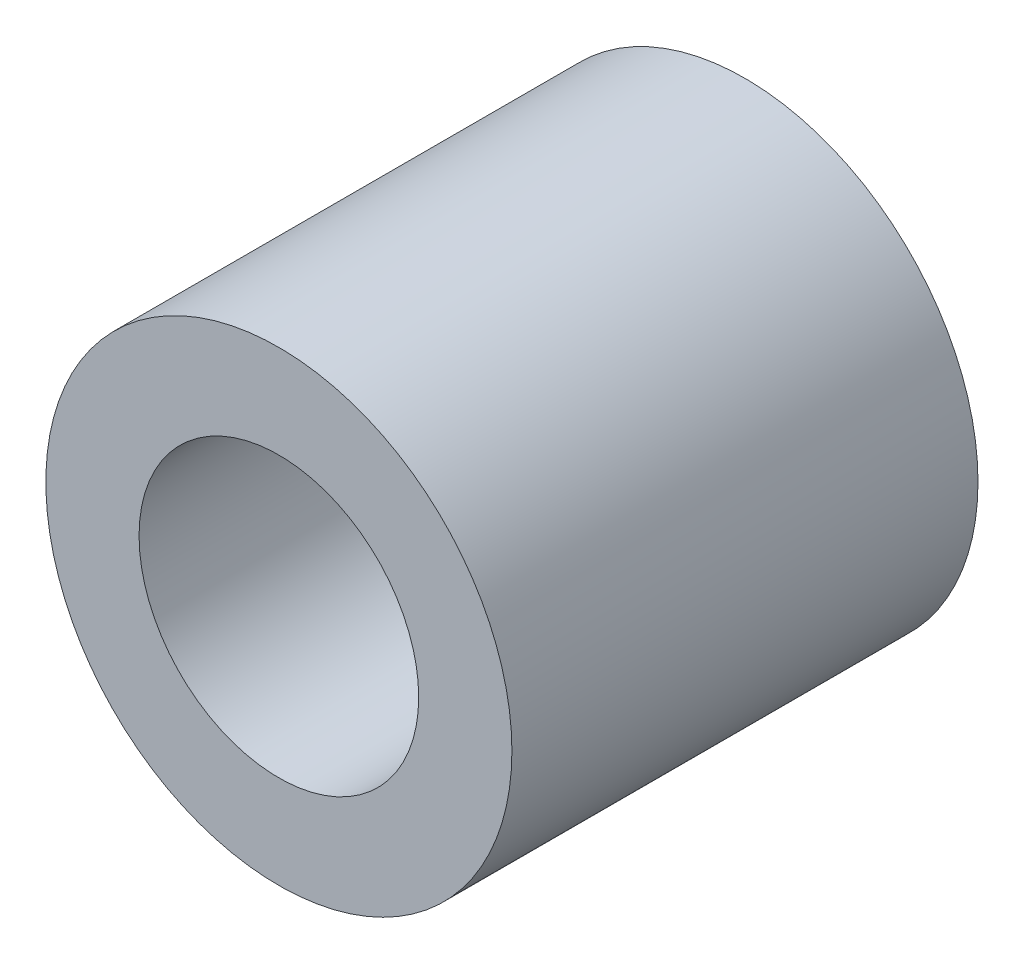
ISO-10303-21;
HEADER;
FILE_DESCRIPTION(('STEP AP214'),'2;1');
FILE_NAME('part.step','',(''),(''),'','','');
FILE_SCHEMA(('AUTOMOTIVE_DESIGN { 1 0 10303 214 1 1 1 1 }'));
ENDSEC;
DATA;
#1=APPLICATION_CONTEXT('core data for automotive mechanical design processes');
#2=APPLICATION_PROTOCOL_DEFINITION('international standard','automotive_design',2000,#1);
#3=PRODUCT_CONTEXT('',#1,'mechanical');
#4=PRODUCT('Part','Part','',(#3));
#5=PRODUCT_RELATED_PRODUCT_CATEGORY('part','',(#4));
#6=PRODUCT_DEFINITION_FORMATION('','',#4);
#7=PRODUCT_DEFINITION_CONTEXT('part definition',#1,'design');
#8=PRODUCT_DEFINITION('design','',#6,#7);
#9=PRODUCT_DEFINITION_SHAPE('','',#8);
#10=(LENGTH_UNIT() NAMED_UNIT(*) SI_UNIT(.MILLI.,.METRE.));
#11=(NAMED_UNIT(*) PLANE_ANGLE_UNIT() SI_UNIT($,.RADIAN.));
#12=(NAMED_UNIT(*) SI_UNIT($,.STERADIAN.) SOLID_ANGLE_UNIT());
#13=UNCERTAINTY_MEASURE_WITH_UNIT(LENGTH_MEASURE(1.E-05),#10,'distance_accuracy_value','');
#14=(GEOMETRIC_REPRESENTATION_CONTEXT(3) GLOBAL_UNCERTAINTY_ASSIGNED_CONTEXT((#13)) GLOBAL_UNIT_ASSIGNED_CONTEXT((#10,
#11,#12)) REPRESENTATION_CONTEXT('',''));
#15=CARTESIAN_POINT('',(0.,0.,0.));
#16=DIRECTION('',(0.,0.,1.));
#17=DIRECTION('',(1.,0.,0.));
#18=AXIS2_PLACEMENT_3D('',#15,#16,#17);
#19=CARTESIAN_POINT('',(0.,0.,10.));
#20=DIRECTION('',(0.,0.,1.));
#21=DIRECTION('',(1.,0.,0.));
#22=AXIS2_PLACEMENT_3D('',#19,#20,#21);
#23=PLANE('',#22);
#24=CARTESIAN_POINT('',(0.,0.,10.));
#25=DIRECTION('',(0.,0.,1.));
#26=DIRECTION('',(1.,0.,0.));
#27=AXIS2_PLACEMENT_3D('',#24,#25,#26);
#28=CIRCLE('',#27,5.);
#29=CARTESIAN_POINT('',(5.,0.,10.));
#30=VERTEX_POINT('',#29);
#31=EDGE_CURVE('E10',#30,#30,#28,.T.);
#32=ORIENTED_EDGE('',*,*,#31,.T.);
#33=EDGE_LOOP('',(#32));
#34=FACE_BOUND('',#33,.T.);
#35=CARTESIAN_POINT('',(0.,0.,10.));
#36=DIRECTION('',(0.,0.,1.));
#37=DIRECTION('',(1.,0.,0.));
#38=AXIS2_PLACEMENT_3D('',#35,#36,#37);
#39=CIRCLE('',#38,3.);
#40=CARTESIAN_POINT('',(3.,0.,10.));
#41=VERTEX_POINT('',#40);
#42=EDGE_CURVE('E48',#41,#41,#39,.T.);
#43=ORIENTED_EDGE('',*,*,#42,.F.);
#44=EDGE_LOOP('',(#43));
#45=FACE_BOUND('',#44,.T.);
#46=ADVANCED_FACE('F37',(#34,#45),#23,.T.);
#47=CARTESIAN_POINT('',(0.,0.,0.));
#48=DIRECTION('',(0.,0.,1.));
#49=DIRECTION('',(1.,0.,0.));
#50=AXIS2_PLACEMENT_3D('',#47,#48,#49);
#51=PLANE('',#50);
#52=CARTESIAN_POINT('',(0.,0.,0.));
#53=DIRECTION('',(0.,0.,1.));
#54=DIRECTION('',(1.,0.,0.));
#55=AXIS2_PLACEMENT_3D('',#52,#53,#54);
#56=CIRCLE('',#55,5.);
#57=CARTESIAN_POINT('',(5.,0.,0.));
#58=VERTEX_POINT('',#57);
#59=EDGE_CURVE('E41',#58,#58,#56,.T.);
#60=ORIENTED_EDGE('',*,*,#59,.F.);
#61=EDGE_LOOP('',(#60));
#62=FACE_BOUND('',#61,.T.);
#63=CARTESIAN_POINT('',(0.,0.,0.));
#64=DIRECTION('',(0.,0.,1.));
#65=DIRECTION('',(1.,0.,0.));
#66=AXIS2_PLACEMENT_3D('',#63,#64,#65);
#67=CIRCLE('',#66,3.);
#68=CARTESIAN_POINT('',(3.,0.,0.));
#69=VERTEX_POINT('',#68);
#70=EDGE_CURVE('E50',#69,#69,#67,.T.);
#71=ORIENTED_EDGE('',*,*,#70,.T.);
#72=EDGE_LOOP('',(#71));
#73=FACE_BOUND('',#72,.T.);
#74=ADVANCED_FACE('F60',(#62,#73),#51,.F.);
#75=CARTESIAN_POINT('',(0.,0.,10.));
#76=DIRECTION('',(0.,0.,-1.));
#77=DIRECTION('',(-1.,0.,0.));
#78=AXIS2_PLACEMENT_3D('',#75,#76,#77);
#79=CYLINDRICAL_SURFACE('',#78,5.);
#80=ORIENTED_EDGE('',*,*,#31,.F.);
#81=EDGE_LOOP('',(#80));
#82=FACE_BOUND('',#81,.T.);
#83=ORIENTED_EDGE('',*,*,#59,.T.);
#84=EDGE_LOOP('',(#83));
#85=FACE_BOUND('',#84,.T.);
#86=ADVANCED_FACE('F39',(#82,#85),#79,.T.);
#87=CARTESIAN_POINT('',(0.,0.,10.));
#88=DIRECTION('',(0.,0.,-1.));
#89=DIRECTION('',(-1.,0.,0.));
#90=AXIS2_PLACEMENT_3D('',#87,#88,#89);
#91=CYLINDRICAL_SURFACE('',#90,3.);
#92=ORIENTED_EDGE('',*,*,#42,.T.);
#93=EDGE_LOOP('',(#92));
#94=FACE_BOUND('',#93,.T.);
#95=ORIENTED_EDGE('',*,*,#70,.F.);
#96=EDGE_LOOP('',(#95));
#97=FACE_BOUND('',#96,.T.);
#98=ADVANCED_FACE('F56',(#94,#97),#91,.F.);
#99=CLOSED_SHELL('',(#46,#74,#86,#98));
#100=MANIFOLD_SOLID_BREP('B2',#99);
#101=ADVANCED_BREP_SHAPE_REPRESENTATION('',(#18,#100),#14);
#102=SHAPE_DEFINITION_REPRESENTATION(#9,#101);
ENDSEC;
END-ISO-10303-21;
